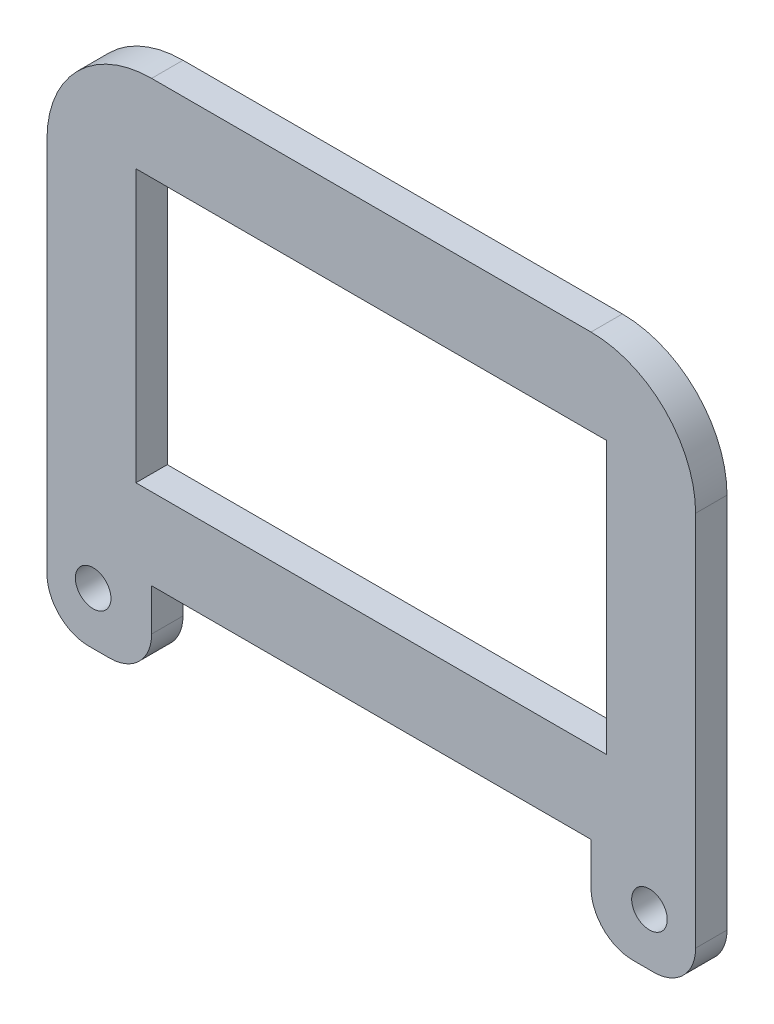
ISO-10303-21;
HEADER;
FILE_DESCRIPTION(('STEP AP214'),'2;1');
FILE_NAME('part.step','',(''),(''),'','','');
FILE_SCHEMA(('AUTOMOTIVE_DESIGN { 1 0 10303 214 1 1 1 1 }'));
ENDSEC;
DATA;
#1=APPLICATION_CONTEXT('core data for automotive mechanical design processes');
#2=APPLICATION_PROTOCOL_DEFINITION('international standard','automotive_design',2000,#1);
#3=PRODUCT_CONTEXT('',#1,'mechanical');
#4=PRODUCT('Part','Part','',(#3));
#5=PRODUCT_RELATED_PRODUCT_CATEGORY('part','',(#4));
#6=PRODUCT_DEFINITION_FORMATION('','',#4);
#7=PRODUCT_DEFINITION_CONTEXT('part definition',#1,'design');
#8=PRODUCT_DEFINITION('design','',#6,#7);
#9=PRODUCT_DEFINITION_SHAPE('','',#8);
#10=(LENGTH_UNIT() NAMED_UNIT(*) SI_UNIT(.MILLI.,.METRE.));
#11=(NAMED_UNIT(*) PLANE_ANGLE_UNIT() SI_UNIT($,.RADIAN.));
#12=(NAMED_UNIT(*) SI_UNIT($,.STERADIAN.) SOLID_ANGLE_UNIT());
#13=UNCERTAINTY_MEASURE_WITH_UNIT(LENGTH_MEASURE(1.E-05),#10,'distance_accuracy_value','');
#14=(GEOMETRIC_REPRESENTATION_CONTEXT(3) GLOBAL_UNCERTAINTY_ASSIGNED_CONTEXT((#13)) GLOBAL_UNIT_ASSIGNED_CONTEXT((#10,
#11,#12)) REPRESENTATION_CONTEXT('',''));
#15=CARTESIAN_POINT('',(0.,0.,0.));
#16=DIRECTION('',(0.,0.,1.));
#17=DIRECTION('',(1.,0.,0.));
#18=AXIS2_PLACEMENT_3D('',#15,#16,#17);
#19=CARTESIAN_POINT('',(31.,-25.,3.));
#20=DIRECTION('',(0.,1.,0.));
#21=DIRECTION('',(-1.,0.,0.));
#22=AXIS2_PLACEMENT_3D('',#19,#20,#21);
#23=PLANE('',#22);
#24=DIRECTION('',(1.,0.,0.));
#25=VECTOR('',#24,1.);
#26=CARTESIAN_POINT('',(31.,-25.,0.));
#27=LINE('',#26,#25);
#28=CARTESIAN_POINT('',(-27.,-25.,0.));
#29=VERTEX_POINT('',#28);
#30=CARTESIAN_POINT('',(-25.,-25.,0.));
#31=VERTEX_POINT('',#30);
#32=EDGE_CURVE('E253',#29,#31,#27,.T.);
#33=ORIENTED_EDGE('',*,*,#32,.T.);
#34=DIRECTION('',(0.,0.,1.));
#35=VECTOR('',#34,1.);
#36=CARTESIAN_POINT('',(-25.,-25.,3.));
#37=LINE('',#36,#35);
#38=CARTESIAN_POINT('',(-25.,-25.,3.));
#39=VERTEX_POINT('',#38);
#40=EDGE_CURVE('E304',#31,#39,#37,.T.);
#41=ORIENTED_EDGE('',*,*,#40,.T.);
#42=DIRECTION('',(1.,0.,0.));
#43=VECTOR('',#42,1.);
#44=CARTESIAN_POINT('',(31.,-25.,3.));
#45=LINE('',#44,#43);
#46=CARTESIAN_POINT('',(-27.,-25.,3.));
#47=VERTEX_POINT('',#46);
#48=EDGE_CURVE('E243',#47,#39,#45,.T.);
#49=ORIENTED_EDGE('',*,*,#48,.F.);
#50=DIRECTION('',(0.,0.,-1.));
#51=VECTOR('',#50,1.);
#52=CARTESIAN_POINT('',(-27.,-25.,3.));
#53=LINE('',#52,#51);
#54=EDGE_CURVE('E302',#47,#29,#53,.T.);
#55=ORIENTED_EDGE('',*,*,#54,.T.);
#56=EDGE_LOOP('',(#33,#41,#49,#55));
#57=FACE_BOUND('',#56,.T.);
#58=ADVANCED_FACE('F33',(#57),#23,.F.);
#59=CARTESIAN_POINT('',(-31.,-25.,3.));
#60=DIRECTION('',(1.,0.,0.));
#61=DIRECTION('',(0.,0.,-1.));
#62=AXIS2_PLACEMENT_3D('',#59,#60,#61);
#63=PLANE('',#62);
#64=DIRECTION('',(0.,-1.,0.));
#65=VECTOR('',#64,1.);
#66=CARTESIAN_POINT('',(-31.,-25.,0.));
#67=LINE('',#66,#65);
#68=CARTESIAN_POINT('',(-31.,15.,0.));
#69=VERTEX_POINT('',#68);
#70=CARTESIAN_POINT('',(-31.,-21.,0.));
#71=VERTEX_POINT('',#70);
#72=EDGE_CURVE('E235',#69,#71,#67,.T.);
#73=ORIENTED_EDGE('',*,*,#72,.T.);
#74=DIRECTION('',(0.,0.,-1.));
#75=VECTOR('',#74,1.);
#76=CARTESIAN_POINT('',(-31.,-21.,3.));
#77=LINE('',#76,#75);
#78=CARTESIAN_POINT('',(-31.,-21.,3.));
#79=VERTEX_POINT('',#78);
#80=EDGE_CURVE('E11',#71,#79,#77,.F.);
#81=ORIENTED_EDGE('',*,*,#80,.T.);
#82=DIRECTION('',(0.,-1.,0.));
#83=VECTOR('',#82,1.);
#84=CARTESIAN_POINT('',(-31.,-25.,3.));
#85=LINE('',#84,#83);
#86=CARTESIAN_POINT('',(-31.,15.,3.));
#87=VERTEX_POINT('',#86);
#88=EDGE_CURVE('E236',#87,#79,#85,.T.);
#89=ORIENTED_EDGE('',*,*,#88,.F.);
#90=DIRECTION('',(0.,0.,-1.));
#91=VECTOR('',#90,1.);
#92=CARTESIAN_POINT('',(-31.,15.,3.));
#93=LINE('',#92,#91);
#94=EDGE_CURVE('E249',#87,#69,#93,.T.);
#95=ORIENTED_EDGE('',*,*,#94,.T.);
#96=EDGE_LOOP('',(#73,#81,#89,#95));
#97=FACE_BOUND('',#96,.T.);
#98=ADVANCED_FACE('F327',(#97),#63,.F.);
#99=CARTESIAN_POINT('',(25.,-25.,3.));
#100=VERTEX_POINT('',#99);
#101=CARTESIAN_POINT('',(27.,-25.,3.));
#102=VERTEX_POINT('',#101);
#103=EDGE_CURVE('E239',#100,#102,#45,.T.);
#104=ORIENTED_EDGE('',*,*,#103,.F.);
#105=DIRECTION('',(0.,0.,1.));
#106=VECTOR('',#105,1.);
#107=CARTESIAN_POINT('',(25.,-25.,3.));
#108=LINE('',#107,#106);
#109=CARTESIAN_POINT('',(25.,-25.,0.));
#110=VERTEX_POINT('',#109);
#111=EDGE_CURVE('E291',#100,#110,#108,.F.);
#112=ORIENTED_EDGE('',*,*,#111,.T.);
#113=CARTESIAN_POINT('',(27.,-25.,0.));
#114=VERTEX_POINT('',#113);
#115=EDGE_CURVE('E252',#110,#114,#27,.T.);
#116=ORIENTED_EDGE('',*,*,#115,.T.);
#117=DIRECTION('',(0.,0.,-1.));
#118=VECTOR('',#117,1.);
#119=CARTESIAN_POINT('',(27.,-25.,3.));
#120=LINE('',#119,#118);
#121=EDGE_CURVE('E289',#114,#102,#120,.F.);
#122=ORIENTED_EDGE('',*,*,#121,.T.);
#123=EDGE_LOOP('',(#104,#112,#116,#122));
#124=FACE_BOUND('',#123,.T.);
#125=ADVANCED_FACE('F354',(#124),#23,.F.);
#126=CARTESIAN_POINT('',(31.,-25.,3.));
#127=DIRECTION('',(-1.,0.,0.));
#128=DIRECTION('',(0.,0.,1.));
#129=AXIS2_PLACEMENT_3D('',#126,#127,#128);
#130=PLANE('',#129);
#131=DIRECTION('',(0.,1.,0.));
#132=VECTOR('',#131,1.);
#133=CARTESIAN_POINT('',(31.,-25.,3.));
#134=LINE('',#133,#132);
#135=CARTESIAN_POINT('',(31.,-21.,3.));
#136=VERTEX_POINT('',#135);
#137=CARTESIAN_POINT('',(31.,15.,3.));
#138=VERTEX_POINT('',#137);
#139=EDGE_CURVE('E244',#136,#138,#134,.T.);
#140=ORIENTED_EDGE('',*,*,#139,.F.);
#141=DIRECTION('',(0.,0.,-1.));
#142=VECTOR('',#141,1.);
#143=CARTESIAN_POINT('',(31.,-21.,3.));
#144=LINE('',#143,#142);
#145=CARTESIAN_POINT('',(31.,-21.,0.));
#146=VERTEX_POINT('',#145);
#147=EDGE_CURVE('E299',#136,#146,#144,.T.);
#148=ORIENTED_EDGE('',*,*,#147,.T.);
#149=DIRECTION('',(0.,1.,0.));
#150=VECTOR('',#149,1.);
#151=CARTESIAN_POINT('',(31.,-25.,0.));
#152=LINE('',#151,#150);
#153=CARTESIAN_POINT('',(31.,15.,0.));
#154=VERTEX_POINT('',#153);
#155=EDGE_CURVE('E255',#146,#154,#152,.T.);
#156=ORIENTED_EDGE('',*,*,#155,.T.);
#157=DIRECTION('',(0.,0.,-1.));
#158=VECTOR('',#157,1.);
#159=CARTESIAN_POINT('',(31.,15.,3.));
#160=LINE('',#159,#158);
#161=EDGE_CURVE('E275',#154,#138,#160,.F.);
#162=ORIENTED_EDGE('',*,*,#161,.T.);
#163=EDGE_LOOP('',(#140,#148,#156,#162));
#164=FACE_BOUND('',#163,.T.);
#165=ADVANCED_FACE('F346',(#164),#130,.F.);
#166=CARTESIAN_POINT('',(31.,25.,3.));
#167=DIRECTION('',(0.,-1.,0.));
#168=DIRECTION('',(1.,0.,0.));
#169=AXIS2_PLACEMENT_3D('',#166,#167,#168);
#170=PLANE('',#169);
#171=DIRECTION('',(-1.,0.,0.));
#172=VECTOR('',#171,1.);
#173=CARTESIAN_POINT('',(31.,25.,0.));
#174=LINE('',#173,#172);
#175=CARTESIAN_POINT('',(21.,25.,0.));
#176=VERTEX_POINT('',#175);
#177=CARTESIAN_POINT('',(-21.,25.,0.));
#178=VERTEX_POINT('',#177);
#179=EDGE_CURVE('E240',#176,#178,#174,.T.);
#180=ORIENTED_EDGE('',*,*,#179,.T.);
#181=DIRECTION('',(0.,0.,-1.));
#182=VECTOR('',#181,1.);
#183=CARTESIAN_POINT('',(-21.,25.,3.));
#184=LINE('',#183,#182);
#185=CARTESIAN_POINT('',(-21.,25.,3.));
#186=VERTEX_POINT('',#185);
#187=EDGE_CURVE('E269',#178,#186,#184,.F.);
#188=ORIENTED_EDGE('',*,*,#187,.T.);
#189=DIRECTION('',(-1.,0.,0.));
#190=VECTOR('',#189,1.);
#191=CARTESIAN_POINT('',(31.,25.,3.));
#192=LINE('',#191,#190);
#193=CARTESIAN_POINT('',(21.,25.,3.));
#194=VERTEX_POINT('',#193);
#195=EDGE_CURVE('E246',#194,#186,#192,.T.);
#196=ORIENTED_EDGE('',*,*,#195,.F.);
#197=DIRECTION('',(0.,0.,-1.));
#198=VECTOR('',#197,1.);
#199=CARTESIAN_POINT('',(21.,25.,3.));
#200=LINE('',#199,#198);
#201=EDGE_CURVE('E266',#194,#176,#200,.T.);
#202=ORIENTED_EDGE('',*,*,#201,.T.);
#203=EDGE_LOOP('',(#180,#188,#196,#202));
#204=FACE_BOUND('',#203,.T.);
#205=ADVANCED_FACE('F335',(#204),#170,.F.);
#206=CARTESIAN_POINT('',(0.,0.,3.));
#207=DIRECTION('',(0.,0.,1.));
#208=DIRECTION('',(1.,0.,0.));
#209=AXIS2_PLACEMENT_3D('',#206,#207,#208);
#210=PLANE('',#209);
#211=DIRECTION('',(0.,-1.,0.));
#212=VECTOR('',#211,1.);
#213=CARTESIAN_POINT('',(-22.5,-9.22792826322613,3.));
#214=LINE('',#213,#212);
#215=CARTESIAN_POINT('',(-22.5,16.7720717367739,3.));
#216=VERTEX_POINT('',#215);
#217=CARTESIAN_POINT('',(-22.5,-9.22792826322613,3.));
#218=VERTEX_POINT('',#217);
#219=EDGE_CURVE('E167',#216,#218,#214,.T.);
#220=ORIENTED_EDGE('',*,*,#219,.F.);
#221=DIRECTION('',(-1.,0.,0.));
#222=VECTOR('',#221,1.);
#223=CARTESIAN_POINT('',(22.5,16.7720717367739,3.));
#224=LINE('',#223,#222);
#225=CARTESIAN_POINT('',(22.5,16.7720717367739,3.));
#226=VERTEX_POINT('',#225);
#227=EDGE_CURVE('E185',#226,#216,#224,.T.);
#228=ORIENTED_EDGE('',*,*,#227,.F.);
#229=DIRECTION('',(0.,1.,0.));
#230=VECTOR('',#229,1.);
#231=CARTESIAN_POINT('',(22.5,-9.22792826322613,3.));
#232=LINE('',#231,#230);
#233=CARTESIAN_POINT('',(22.5,-9.22792826322613,3.));
#234=VERTEX_POINT('',#233);
#235=EDGE_CURVE('E188',#234,#226,#232,.T.);
#236=ORIENTED_EDGE('',*,*,#235,.F.);
#237=DIRECTION('',(1.,0.,0.));
#238=VECTOR('',#237,1.);
#239=CARTESIAN_POINT('',(22.5,-9.22792826322613,3.));
#240=LINE('',#239,#238);
#241=EDGE_CURVE('E194',#218,#234,#240,.T.);
#242=ORIENTED_EDGE('',*,*,#241,.F.);
#243=EDGE_LOOP('',(#220,#228,#236,#242));
#244=FACE_BOUND('',#243,.T.);
#245=DIRECTION('',(0.,1.,0.));
#246=VECTOR('',#245,1.);
#247=CARTESIAN_POINT('',(21.,-25.,3.));
#248=LINE('',#247,#246);
#249=CARTESIAN_POINT('',(21.,-21.,3.));
#250=VERTEX_POINT('',#249);
#251=CARTESIAN_POINT('',(21.,-17.,3.));
#252=VERTEX_POINT('',#251);
#253=EDGE_CURVE('E215',#250,#252,#248,.T.);
#254=ORIENTED_EDGE('',*,*,#253,.F.);
#255=CARTESIAN_POINT('',(25.,-21.,3.));
#256=DIRECTION('',(0.,0.,1.));
#257=DIRECTION('',(1.,0.,0.));
#258=AXIS2_PLACEMENT_3D('',#255,#256,#257);
#259=CIRCLE('',#258,4.);
#260=EDGE_CURVE('E287',#250,#100,#259,.T.);
#261=ORIENTED_EDGE('',*,*,#260,.T.);
#262=ORIENTED_EDGE('',*,*,#103,.T.);
#263=CARTESIAN_POINT('',(27.,-21.,3.));
#264=DIRECTION('',(0.,0.,1.));
#265=DIRECTION('',(1.,0.,0.));
#266=AXIS2_PLACEMENT_3D('',#263,#264,#265);
#267=CIRCLE('',#266,4.);
#268=EDGE_CURVE('E285',#102,#136,#267,.T.);
#269=ORIENTED_EDGE('',*,*,#268,.T.);
#270=ORIENTED_EDGE('',*,*,#139,.T.);
#271=CARTESIAN_POINT('',(21.,15.,3.));
#272=DIRECTION('',(0.,0.,1.));
#273=DIRECTION('',(1.,0.,0.));
#274=AXIS2_PLACEMENT_3D('',#271,#272,#273);
#275=CIRCLE('',#274,10.);
#276=EDGE_CURVE('E271',#138,#194,#275,.T.);
#277=ORIENTED_EDGE('',*,*,#276,.T.);
#278=ORIENTED_EDGE('',*,*,#195,.T.);
#279=CARTESIAN_POINT('',(-21.,15.,3.));
#280=DIRECTION('',(0.,0.,1.));
#281=DIRECTION('',(1.,0.,0.));
#282=AXIS2_PLACEMENT_3D('',#279,#280,#281);
#283=CIRCLE('',#282,10.);
#284=EDGE_CURVE('E273',#186,#87,#283,.T.);
#285=ORIENTED_EDGE('',*,*,#284,.T.);
#286=ORIENTED_EDGE('',*,*,#88,.T.);
#287=CARTESIAN_POINT('',(-27.,-21.,3.));
#288=DIRECTION('',(0.,0.,1.));
#289=DIRECTION('',(1.,0.,0.));
#290=AXIS2_PLACEMENT_3D('',#287,#288,#289);
#291=CIRCLE('',#290,4.);
#292=EDGE_CURVE('E281',#79,#47,#291,.T.);
#293=ORIENTED_EDGE('',*,*,#292,.T.);
#294=ORIENTED_EDGE('',*,*,#48,.T.);
#295=CARTESIAN_POINT('',(-25.,-21.,3.));
#296=DIRECTION('',(0.,0.,1.));
#297=DIRECTION('',(1.,0.,0.));
#298=AXIS2_PLACEMENT_3D('',#295,#296,#297);
#299=CIRCLE('',#298,4.);
#300=CARTESIAN_POINT('',(-21.,-21.,3.));
#301=VERTEX_POINT('',#300);
#302=EDGE_CURVE('E283',#39,#301,#299,.T.);
#303=ORIENTED_EDGE('',*,*,#302,.T.);
#304=DIRECTION('',(0.,-1.,0.));
#305=VECTOR('',#304,1.);
#306=CARTESIAN_POINT('',(-21.,-25.,3.));
#307=LINE('',#306,#305);
#308=CARTESIAN_POINT('',(-21.,-17.,3.));
#309=VERTEX_POINT('',#308);
#310=EDGE_CURVE('E200',#309,#301,#307,.T.);
#311=ORIENTED_EDGE('',*,*,#310,.F.);
#312=DIRECTION('',(-1.,0.,0.));
#313=VECTOR('',#312,1.);
#314=CARTESIAN_POINT('',(-21.,-17.,3.));
#315=LINE('',#314,#313);
#316=EDGE_CURVE('E207',#252,#309,#315,.T.);
#317=ORIENTED_EDGE('',*,*,#316,.F.);
#318=EDGE_LOOP('',(#254,#261,#262,#269,#270,#277,#278,#285,#286,#293,#294,#303,#311,#317));
#319=FACE_BOUND('',#318,.T.);
#320=CARTESIAN_POINT('',(-26.5864325766787,-19.9999999999998,3.));
#321=DIRECTION('',(0.,0.,1.));
#322=DIRECTION('',(1.,0.,0.));
#323=AXIS2_PLACEMENT_3D('',#320,#321,#322);
#324=CIRCLE('',#323,1.69999999999999);
#325=CARTESIAN_POINT('',(-24.8864325766787,-19.9999999999998,3.));
#326=VERTEX_POINT('',#325);
#327=EDGE_CURVE('E221',#326,#326,#324,.T.);
#328=ORIENTED_EDGE('',*,*,#327,.F.);
#329=EDGE_LOOP('',(#328));
#330=FACE_BOUND('',#329,.T.);
#331=CARTESIAN_POINT('',(26.5864325766788,-19.9999999999998,3.));
#332=DIRECTION('',(0.,0.,1.));
#333=DIRECTION('',(1.,0.,0.));
#334=AXIS2_PLACEMENT_3D('',#331,#332,#333);
#335=CIRCLE('',#334,1.69999999999999);
#336=CARTESIAN_POINT('',(28.2864325766787,-19.9999999999998,3.));
#337=VERTEX_POINT('',#336);
#338=EDGE_CURVE('E229',#337,#337,#335,.T.);
#339=ORIENTED_EDGE('',*,*,#338,.F.);
#340=EDGE_LOOP('',(#339));
#341=FACE_BOUND('',#340,.T.);
#342=ADVANCED_FACE('F321',(#244,#319,#330,#341),#210,.T.);
#343=CARTESIAN_POINT('',(0.,0.,0.));
#344=DIRECTION('',(0.,0.,1.));
#345=DIRECTION('',(1.,0.,0.));
#346=AXIS2_PLACEMENT_3D('',#343,#344,#345);
#347=PLANE('',#346);
#348=DIRECTION('',(-1.,0.,0.));
#349=VECTOR('',#348,1.);
#350=CARTESIAN_POINT('',(22.5,16.7720717367739,0.));
#351=LINE('',#350,#349);
#352=CARTESIAN_POINT('',(22.5,16.7720717367739,0.));
#353=VERTEX_POINT('',#352);
#354=CARTESIAN_POINT('',(-22.5,16.7720717367739,0.));
#355=VERTEX_POINT('',#354);
#356=EDGE_CURVE('E172',#353,#355,#351,.T.);
#357=ORIENTED_EDGE('',*,*,#356,.T.);
#358=DIRECTION('',(0.,-1.,0.));
#359=VECTOR('',#358,1.);
#360=CARTESIAN_POINT('',(-22.5,-9.22792826322613,0.));
#361=LINE('',#360,#359);
#362=CARTESIAN_POINT('',(-22.5,-9.22792826322613,0.));
#363=VERTEX_POINT('',#362);
#364=EDGE_CURVE('E164',#355,#363,#361,.T.);
#365=ORIENTED_EDGE('',*,*,#364,.T.);
#366=DIRECTION('',(1.,0.,0.));
#367=VECTOR('',#366,1.);
#368=CARTESIAN_POINT('',(22.5,-9.22792826322613,0.));
#369=LINE('',#368,#367);
#370=CARTESIAN_POINT('',(22.5,-9.22792826322613,0.));
#371=VERTEX_POINT('',#370);
#372=EDGE_CURVE('E176',#363,#371,#369,.T.);
#373=ORIENTED_EDGE('',*,*,#372,.T.);
#374=DIRECTION('',(0.,1.,0.));
#375=VECTOR('',#374,1.);
#376=CARTESIAN_POINT('',(22.5,-9.22792826322613,0.));
#377=LINE('',#376,#375);
#378=EDGE_CURVE('E180',#371,#353,#377,.T.);
#379=ORIENTED_EDGE('',*,*,#378,.T.);
#380=EDGE_LOOP('',(#357,#365,#373,#379));
#381=FACE_BOUND('',#380,.T.);
#382=CARTESIAN_POINT('',(-26.5864325766787,-19.9999999999998,0.));
#383=DIRECTION('',(0.,0.,1.));
#384=DIRECTION('',(1.,0.,0.));
#385=AXIS2_PLACEMENT_3D('',#382,#383,#384);
#386=CIRCLE('',#385,1.7);
#387=CARTESIAN_POINT('',(-24.8864325766787,-19.9999999999998,0.));
#388=VERTEX_POINT('',#387);
#389=EDGE_CURVE('E226',#388,#388,#386,.T.);
#390=ORIENTED_EDGE('',*,*,#389,.T.);
#391=EDGE_LOOP('',(#390));
#392=FACE_BOUND('',#391,.T.);
#393=CARTESIAN_POINT('',(26.5864325766788,-19.9999999999998,0.));
#394=DIRECTION('',(0.,0.,1.));
#395=DIRECTION('',(1.,0.,0.));
#396=AXIS2_PLACEMENT_3D('',#393,#394,#395);
#397=CIRCLE('',#396,1.7);
#398=CARTESIAN_POINT('',(28.2864325766788,-19.9999999999998,0.));
#399=VERTEX_POINT('',#398);
#400=EDGE_CURVE('E232',#399,#399,#397,.T.);
#401=ORIENTED_EDGE('',*,*,#400,.T.);
#402=EDGE_LOOP('',(#401));
#403=FACE_BOUND('',#402,.T.);
#404=ORIENTED_EDGE('',*,*,#115,.F.);
#405=CARTESIAN_POINT('',(25.,-21.,0.));
#406=DIRECTION('',(0.,0.,1.));
#407=DIRECTION('',(1.,0.,0.));
#408=AXIS2_PLACEMENT_3D('',#405,#406,#407);
#409=CIRCLE('',#408,4.);
#410=CARTESIAN_POINT('',(21.,-21.,0.));
#411=VERTEX_POINT('',#410);
#412=EDGE_CURVE('E297',#110,#411,#409,.F.);
#413=ORIENTED_EDGE('',*,*,#412,.T.);
#414=DIRECTION('',(0.,1.,0.));
#415=VECTOR('',#414,1.);
#416=CARTESIAN_POINT('',(21.,-25.,0.));
#417=LINE('',#416,#415);
#418=CARTESIAN_POINT('',(21.,-17.,0.));
#419=VERTEX_POINT('',#418);
#420=EDGE_CURVE('E206',#411,#419,#417,.T.);
#421=ORIENTED_EDGE('',*,*,#420,.T.);
#422=DIRECTION('',(-1.,0.,0.));
#423=VECTOR('',#422,1.);
#424=CARTESIAN_POINT('',(-21.,-17.,0.));
#425=LINE('',#424,#423);
#426=CARTESIAN_POINT('',(-21.,-17.,0.));
#427=VERTEX_POINT('',#426);
#428=EDGE_CURVE('E209',#419,#427,#425,.T.);
#429=ORIENTED_EDGE('',*,*,#428,.T.);
#430=DIRECTION('',(0.,-1.,0.));
#431=VECTOR('',#430,1.);
#432=CARTESIAN_POINT('',(-21.,-25.,0.));
#433=LINE('',#432,#431);
#434=CARTESIAN_POINT('',(-21.,-21.,0.));
#435=VERTEX_POINT('',#434);
#436=EDGE_CURVE('E204',#427,#435,#433,.T.);
#437=ORIENTED_EDGE('',*,*,#436,.T.);
#438=CARTESIAN_POINT('',(-25.,-21.,0.));
#439=DIRECTION('',(0.,0.,1.));
#440=DIRECTION('',(1.,0.,0.));
#441=AXIS2_PLACEMENT_3D('',#438,#439,#440);
#442=CIRCLE('',#441,4.);
#443=EDGE_CURVE('E48',#435,#31,#442,.F.);
#444=ORIENTED_EDGE('',*,*,#443,.T.);
#445=ORIENTED_EDGE('',*,*,#32,.F.);
#446=CARTESIAN_POINT('',(-27.,-21.,0.));
#447=DIRECTION('',(0.,0.,1.));
#448=DIRECTION('',(1.,0.,0.));
#449=AXIS2_PLACEMENT_3D('',#446,#447,#448);
#450=CIRCLE('',#449,4.);
#451=EDGE_CURVE('E56',#29,#71,#450,.F.);
#452=ORIENTED_EDGE('',*,*,#451,.T.);
#453=ORIENTED_EDGE('',*,*,#72,.F.);
#454=CARTESIAN_POINT('',(-21.,15.,0.));
#455=DIRECTION('',(0.,0.,1.));
#456=DIRECTION('',(1.,0.,0.));
#457=AXIS2_PLACEMENT_3D('',#454,#455,#456);
#458=CIRCLE('',#457,10.);
#459=EDGE_CURVE('E264',#69,#178,#458,.F.);
#460=ORIENTED_EDGE('',*,*,#459,.T.);
#461=ORIENTED_EDGE('',*,*,#179,.F.);
#462=CARTESIAN_POINT('',(21.,15.,0.));
#463=DIRECTION('',(0.,0.,1.));
#464=DIRECTION('',(1.,0.,0.));
#465=AXIS2_PLACEMENT_3D('',#462,#463,#464);
#466=CIRCLE('',#465,10.);
#467=EDGE_CURVE('E261',#176,#154,#466,.F.);
#468=ORIENTED_EDGE('',*,*,#467,.T.);
#469=ORIENTED_EDGE('',*,*,#155,.F.);
#470=CARTESIAN_POINT('',(27.,-21.,0.));
#471=DIRECTION('',(0.,0.,1.));
#472=DIRECTION('',(1.,0.,0.));
#473=AXIS2_PLACEMENT_3D('',#470,#471,#472);
#474=CIRCLE('',#473,4.);
#475=EDGE_CURVE('E295',#146,#114,#474,.F.);
#476=ORIENTED_EDGE('',*,*,#475,.T.);
#477=EDGE_LOOP('',(#404,#413,#421,#429,#437,#444,#445,#452,#453,#460,#461,#468,#469,#476));
#478=FACE_BOUND('',#477,.T.);
#479=ADVANCED_FACE('F182',(#381,#392,#403,#478),#347,.F.);
#480=CARTESIAN_POINT('',(26.5864325766788,-19.9999999999998,3.));
#481=DIRECTION('',(0.,0.,1.));
#482=DIRECTION('',(1.,0.,0.));
#483=AXIS2_PLACEMENT_3D('',#480,#481,#482);
#484=CYLINDRICAL_SURFACE('',#483,1.69999999999999);
#485=ORIENTED_EDGE('',*,*,#400,.F.);
#486=EDGE_LOOP('',(#485));
#487=FACE_BOUND('',#486,.T.);
#488=ORIENTED_EDGE('',*,*,#338,.T.);
#489=EDGE_LOOP('',(#488));
#490=FACE_BOUND('',#489,.T.);
#491=ADVANCED_FACE('F395',(#487,#490),#484,.F.);
#492=CARTESIAN_POINT('',(-26.5864325766787,-19.9999999999998,3.));
#493=DIRECTION('',(0.,0.,1.));
#494=DIRECTION('',(1.,0.,0.));
#495=AXIS2_PLACEMENT_3D('',#492,#493,#494);
#496=CYLINDRICAL_SURFACE('',#495,1.69999999999999);
#497=ORIENTED_EDGE('',*,*,#389,.F.);
#498=EDGE_LOOP('',(#497));
#499=FACE_BOUND('',#498,.T.);
#500=ORIENTED_EDGE('',*,*,#327,.T.);
#501=EDGE_LOOP('',(#500));
#502=FACE_BOUND('',#501,.T.);
#503=ADVANCED_FACE('F374',(#499,#502),#496,.F.);
#504=CARTESIAN_POINT('',(-21.,-25.,0.));
#505=DIRECTION('',(-1.,0.,0.));
#506=DIRECTION('',(0.,0.,1.));
#507=AXIS2_PLACEMENT_3D('',#504,#505,#506);
#508=PLANE('',#507);
#509=ORIENTED_EDGE('',*,*,#310,.T.);
#510=DIRECTION('',(0.,0.,1.));
#511=VECTOR('',#510,1.);
#512=CARTESIAN_POINT('',(-21.,-21.,0.));
#513=LINE('',#512,#511);
#514=EDGE_CURVE('E41',#301,#435,#513,.F.);
#515=ORIENTED_EDGE('',*,*,#514,.T.);
#516=ORIENTED_EDGE('',*,*,#436,.F.);
#517=DIRECTION('',(0.,0.,1.));
#518=VECTOR('',#517,1.);
#519=CARTESIAN_POINT('',(-21.,-17.,0.));
#520=LINE('',#519,#518);
#521=EDGE_CURVE('E219',#427,#309,#520,.T.);
#522=ORIENTED_EDGE('',*,*,#521,.T.);
#523=EDGE_LOOP('',(#509,#515,#516,#522));
#524=FACE_BOUND('',#523,.T.);
#525=ADVANCED_FACE('F309',(#524),#508,.F.);
#526=CARTESIAN_POINT('',(-21.,-17.,0.));
#527=DIRECTION('',(0.,1.,0.));
#528=DIRECTION('',(-1.,0.,0.));
#529=AXIS2_PLACEMENT_3D('',#526,#527,#528);
#530=PLANE('',#529);
#531=ORIENTED_EDGE('',*,*,#316,.T.);
#532=ORIENTED_EDGE('',*,*,#521,.F.);
#533=ORIENTED_EDGE('',*,*,#428,.F.);
#534=DIRECTION('',(0.,0.,1.));
#535=VECTOR('',#534,1.);
#536=CARTESIAN_POINT('',(21.,-17.,0.));
#537=LINE('',#536,#535);
#538=EDGE_CURVE('E212',#419,#252,#537,.T.);
#539=ORIENTED_EDGE('',*,*,#538,.T.);
#540=EDGE_LOOP('',(#531,#532,#533,#539));
#541=FACE_BOUND('',#540,.T.);
#542=ADVANCED_FACE('F366',(#541),#530,.F.);
#543=CARTESIAN_POINT('',(21.,-25.,0.));
#544=DIRECTION('',(1.,0.,0.));
#545=DIRECTION('',(0.,1.,0.));
#546=AXIS2_PLACEMENT_3D('',#543,#544,#545);
#547=PLANE('',#546);
#548=ORIENTED_EDGE('',*,*,#420,.F.);
#549=DIRECTION('',(0.,0.,1.));
#550=VECTOR('',#549,1.);
#551=CARTESIAN_POINT('',(21.,-21.,0.));
#552=LINE('',#551,#550);
#553=EDGE_CURVE('E278',#411,#250,#552,.T.);
#554=ORIENTED_EDGE('',*,*,#553,.T.);
#555=ORIENTED_EDGE('',*,*,#253,.T.);
#556=ORIENTED_EDGE('',*,*,#538,.F.);
#557=EDGE_LOOP('',(#548,#554,#555,#556));
#558=FACE_BOUND('',#557,.T.);
#559=ADVANCED_FACE('F363',(#558),#547,.F.);
#560=CARTESIAN_POINT('',(-22.5,-9.22792826322613,0.));
#561=DIRECTION('',(-1.,0.,0.));
#562=DIRECTION('',(0.,0.,1.));
#563=AXIS2_PLACEMENT_3D('',#560,#561,#562);
#564=PLANE('',#563);
#565=ORIENTED_EDGE('',*,*,#219,.T.);
#566=DIRECTION('',(0.,0.,1.));
#567=VECTOR('',#566,1.);
#568=CARTESIAN_POINT('',(-22.5,-9.22792826322613,0.));
#569=LINE('',#568,#567);
#570=EDGE_CURVE('E160',#363,#218,#569,.T.);
#571=ORIENTED_EDGE('',*,*,#570,.F.);
#572=ORIENTED_EDGE('',*,*,#364,.F.);
#573=DIRECTION('',(0.,0.,1.));
#574=VECTOR('',#573,1.);
#575=CARTESIAN_POINT('',(-22.5,16.7720717367739,0.));
#576=LINE('',#575,#574);
#577=EDGE_CURVE('E198',#355,#216,#576,.T.);
#578=ORIENTED_EDGE('',*,*,#577,.T.);
#579=EDGE_LOOP('',(#565,#571,#572,#578));
#580=FACE_BOUND('',#579,.T.);
#581=ADVANCED_FACE('F162',(#580),#564,.F.);
#582=CARTESIAN_POINT('',(22.5,16.7720717367739,0.));
#583=DIRECTION('',(0.,1.,0.));
#584=DIRECTION('',(-1.,0.,0.));
#585=AXIS2_PLACEMENT_3D('',#582,#583,#584);
#586=PLANE('',#585);
#587=ORIENTED_EDGE('',*,*,#227,.T.);
#588=ORIENTED_EDGE('',*,*,#577,.F.);
#589=ORIENTED_EDGE('',*,*,#356,.F.);
#590=DIRECTION('',(0.,0.,1.));
#591=VECTOR('',#590,1.);
#592=CARTESIAN_POINT('',(22.5,16.7720717367739,0.));
#593=LINE('',#592,#591);
#594=EDGE_CURVE('E201',#353,#226,#593,.T.);
#595=ORIENTED_EDGE('',*,*,#594,.T.);
#596=EDGE_LOOP('',(#587,#588,#589,#595));
#597=FACE_BOUND('',#596,.T.);
#598=ADVANCED_FACE('F481',(#597),#586,.F.);
#599=CARTESIAN_POINT('',(22.5,-9.22792826322613,0.));
#600=DIRECTION('',(1.,0.,0.));
#601=DIRECTION('',(0.,0.,-1.));
#602=AXIS2_PLACEMENT_3D('',#599,#600,#601);
#603=PLANE('',#602);
#604=ORIENTED_EDGE('',*,*,#235,.T.);
#605=ORIENTED_EDGE('',*,*,#594,.F.);
#606=ORIENTED_EDGE('',*,*,#378,.F.);
#607=DIRECTION('',(0.,0.,1.));
#608=VECTOR('',#607,1.);
#609=CARTESIAN_POINT('',(22.5,-9.22792826322613,0.));
#610=LINE('',#609,#608);
#611=EDGE_CURVE('E171',#371,#234,#610,.T.);
#612=ORIENTED_EDGE('',*,*,#611,.T.);
#613=EDGE_LOOP('',(#604,#605,#606,#612));
#614=FACE_BOUND('',#613,.T.);
#615=ADVANCED_FACE('F476',(#614),#603,.F.);
#616=CARTESIAN_POINT('',(22.5,-9.22792826322613,0.));
#617=DIRECTION('',(0.,-1.,0.));
#618=DIRECTION('',(1.,0.,0.));
#619=AXIS2_PLACEMENT_3D('',#616,#617,#618);
#620=PLANE('',#619);
#621=ORIENTED_EDGE('',*,*,#241,.T.);
#622=ORIENTED_EDGE('',*,*,#611,.F.);
#623=ORIENTED_EDGE('',*,*,#372,.F.);
#624=ORIENTED_EDGE('',*,*,#570,.T.);
#625=EDGE_LOOP('',(#621,#622,#623,#624));
#626=FACE_BOUND('',#625,.T.);
#627=ADVANCED_FACE('F177',(#626),#620,.F.);
#628=CARTESIAN_POINT('',(-21.,15.,3.));
#629=DIRECTION('',(0.,0.,-1.));
#630=DIRECTION('',(-1.,0.,0.));
#631=AXIS2_PLACEMENT_3D('',#628,#629,#630);
#632=CYLINDRICAL_SURFACE('',#631,10.);
#633=ORIENTED_EDGE('',*,*,#284,.F.);
#634=ORIENTED_EDGE('',*,*,#187,.F.);
#635=ORIENTED_EDGE('',*,*,#459,.F.);
#636=ORIENTED_EDGE('',*,*,#94,.F.);
#637=EDGE_LOOP('',(#633,#634,#635,#636));
#638=FACE_BOUND('',#637,.T.);
#639=ADVANCED_FACE('F331',(#638),#632,.T.);
#640=CARTESIAN_POINT('',(21.,15.,3.));
#641=DIRECTION('',(0.,0.,-1.));
#642=DIRECTION('',(-1.,0.,0.));
#643=AXIS2_PLACEMENT_3D('',#640,#641,#642);
#644=CYLINDRICAL_SURFACE('',#643,10.);
#645=ORIENTED_EDGE('',*,*,#276,.F.);
#646=ORIENTED_EDGE('',*,*,#161,.F.);
#647=ORIENTED_EDGE('',*,*,#467,.F.);
#648=ORIENTED_EDGE('',*,*,#201,.F.);
#649=EDGE_LOOP('',(#645,#646,#647,#648));
#650=FACE_BOUND('',#649,.T.);
#651=ADVANCED_FACE('F340',(#650),#644,.T.);
#652=CARTESIAN_POINT('',(25.,-21.,0.));
#653=DIRECTION('',(0.,0.,1.));
#654=DIRECTION('',(1.,0.,0.));
#655=AXIS2_PLACEMENT_3D('',#652,#653,#654);
#656=CYLINDRICAL_SURFACE('',#655,4.);
#657=ORIENTED_EDGE('',*,*,#412,.F.);
#658=ORIENTED_EDGE('',*,*,#111,.F.);
#659=ORIENTED_EDGE('',*,*,#260,.F.);
#660=ORIENTED_EDGE('',*,*,#553,.F.);
#661=EDGE_LOOP('',(#657,#658,#659,#660));
#662=FACE_BOUND('',#661,.T.);
#663=ADVANCED_FACE('F360',(#662),#656,.T.);
#664=CARTESIAN_POINT('',(27.,-21.,3.));
#665=DIRECTION('',(0.,0.,-1.));
#666=DIRECTION('',(-1.,0.,0.));
#667=AXIS2_PLACEMENT_3D('',#664,#665,#666);
#668=CYLINDRICAL_SURFACE('',#667,4.);
#669=ORIENTED_EDGE('',*,*,#268,.F.);
#670=ORIENTED_EDGE('',*,*,#121,.F.);
#671=ORIENTED_EDGE('',*,*,#475,.F.);
#672=ORIENTED_EDGE('',*,*,#147,.F.);
#673=EDGE_LOOP('',(#669,#670,#671,#672));
#674=FACE_BOUND('',#673,.T.);
#675=ADVANCED_FACE('F350',(#674),#668,.T.);
#676=CARTESIAN_POINT('',(-25.,-21.,3.));
#677=DIRECTION('',(0.,0.,1.));
#678=DIRECTION('',(1.,0.,0.));
#679=AXIS2_PLACEMENT_3D('',#676,#677,#678);
#680=CYLINDRICAL_SURFACE('',#679,4.);
#681=ORIENTED_EDGE('',*,*,#443,.F.);
#682=ORIENTED_EDGE('',*,*,#514,.F.);
#683=ORIENTED_EDGE('',*,*,#302,.F.);
#684=ORIENTED_EDGE('',*,*,#40,.F.);
#685=EDGE_LOOP('',(#681,#682,#683,#684));
#686=FACE_BOUND('',#685,.T.);
#687=ADVANCED_FACE('F315',(#686),#680,.T.);
#688=CARTESIAN_POINT('',(-27.,-21.,3.));
#689=DIRECTION('',(0.,0.,-1.));
#690=DIRECTION('',(-1.,0.,0.));
#691=AXIS2_PLACEMENT_3D('',#688,#689,#690);
#692=CYLINDRICAL_SURFACE('',#691,4.);
#693=ORIENTED_EDGE('',*,*,#292,.F.);
#694=ORIENTED_EDGE('',*,*,#80,.F.);
#695=ORIENTED_EDGE('',*,*,#451,.F.);
#696=ORIENTED_EDGE('',*,*,#54,.F.);
#697=EDGE_LOOP('',(#693,#694,#695,#696));
#698=FACE_BOUND('',#697,.T.);
#699=ADVANCED_FACE('F35',(#698),#692,.T.);
#700=CLOSED_SHELL('',(#58,#98,#125,#165,#205,#342,#479,#491,#503,#525,#542,#559,#581,#598,#615,
#627,#639,#651,#663,#675,#687,#699));
#701=MANIFOLD_SOLID_BREP('B2',#700);
#702=ADVANCED_BREP_SHAPE_REPRESENTATION('',(#18,#701),#14);
#703=SHAPE_DEFINITION_REPRESENTATION(#9,#702);
ENDSEC;
END-ISO-10303-21;
